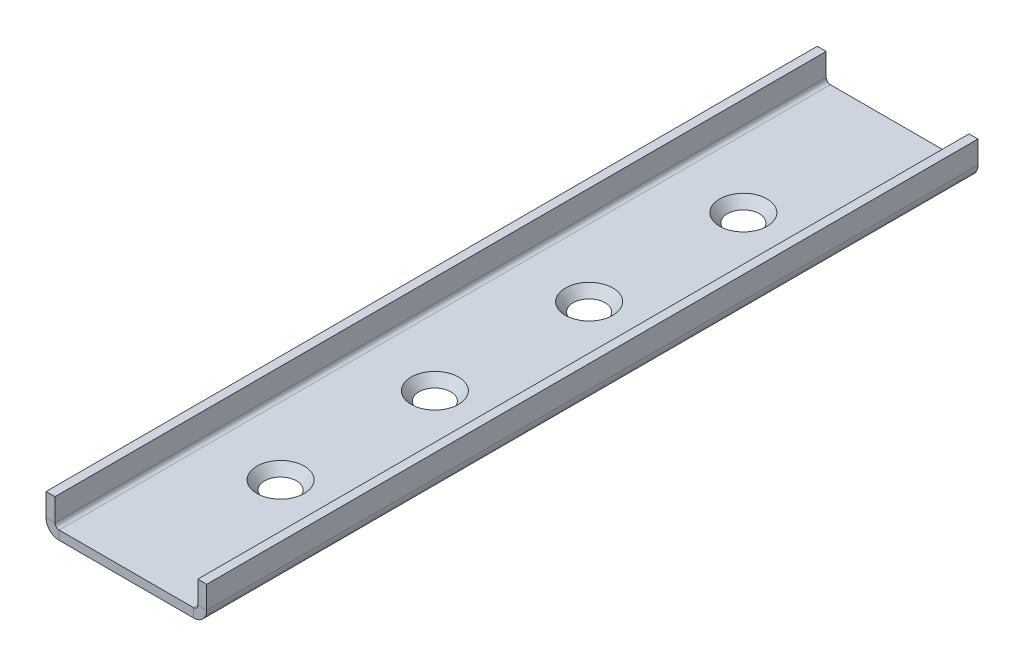
ISO-10303-21;
HEADER;
FILE_DESCRIPTION(('STEP AP214'),'2;1');
FILE_NAME('part.step','',(''),(''),'','','');
FILE_SCHEMA(('AUTOMOTIVE_DESIGN { 1 0 10303 214 1 1 1 1 }'));
ENDSEC;
DATA;
#1=APPLICATION_CONTEXT('core data for automotive mechanical design processes');
#2=APPLICATION_PROTOCOL_DEFINITION('international standard','automotive_design',2000,#1);
#3=PRODUCT_CONTEXT('',#1,'mechanical');
#4=PRODUCT('Part','Part','',(#3));
#5=PRODUCT_RELATED_PRODUCT_CATEGORY('part','',(#4));
#6=PRODUCT_DEFINITION_FORMATION('','',#4);
#7=PRODUCT_DEFINITION_CONTEXT('part definition',#1,'design');
#8=PRODUCT_DEFINITION('design','',#6,#7);
#9=PRODUCT_DEFINITION_SHAPE('','',#8);
#10=(LENGTH_UNIT() NAMED_UNIT(*) SI_UNIT(.MILLI.,.METRE.));
#11=(NAMED_UNIT(*) PLANE_ANGLE_UNIT() SI_UNIT($,.RADIAN.));
#12=(NAMED_UNIT(*) SI_UNIT($,.STERADIAN.) SOLID_ANGLE_UNIT());
#13=UNCERTAINTY_MEASURE_WITH_UNIT(LENGTH_MEASURE(1.E-05),#10,'distance_accuracy_value','');
#14=(GEOMETRIC_REPRESENTATION_CONTEXT(3) GLOBAL_UNCERTAINTY_ASSIGNED_CONTEXT((#13)) GLOBAL_UNIT_ASSIGNED_CONTEXT((#10,
#11,#12)) REPRESENTATION_CONTEXT('',''));
#15=CARTESIAN_POINT('',(0.,0.,0.));
#16=DIRECTION('',(0.,0.,1.));
#17=DIRECTION('',(1.,0.,0.));
#18=AXIS2_PLACEMENT_3D('',#15,#16,#17);
#19=CARTESIAN_POINT('',(0.,0.,0.));
#20=DIRECTION('',(0.,-1.,0.));
#21=DIRECTION('',(0.,0.,-1.));
#22=AXIS2_PLACEMENT_3D('',#19,#20,#21);
#23=PLANE('',#22);
#24=CARTESIAN_POINT('',(0.,0.,13.716));
#25=DIRECTION('',(0.,1.,0.));
#26=DIRECTION('',(0.,0.,1.));
#27=AXIS2_PLACEMENT_3D('',#24,#25,#26);
#28=CIRCLE('',#27,4.2164);
#29=CARTESIAN_POINT('',(0.,0.,17.9324));
#30=VERTEX_POINT('',#29);
#31=EDGE_CURVE('E230',#30,#30,#28,.T.);
#32=ORIENTED_EDGE('',*,*,#31,.F.);
#33=EDGE_LOOP('',(#32));
#34=FACE_BOUND('',#33,.T.);
#35=CARTESIAN_POINT('',(0.,0.,-41.148));
#36=DIRECTION('',(0.,1.,0.));
#37=DIRECTION('',(0.,0.,1.));
#38=AXIS2_PLACEMENT_3D('',#35,#36,#37);
#39=CIRCLE('',#38,4.2164);
#40=CARTESIAN_POINT('',(0.,0.,-36.9316));
#41=VERTEX_POINT('',#40);
#42=EDGE_CURVE('E225',#41,#41,#39,.T.);
#43=ORIENTED_EDGE('',*,*,#42,.F.);
#44=EDGE_LOOP('',(#43));
#45=FACE_BOUND('',#44,.T.);
#46=DIRECTION('',(0.,0.,-1.));
#47=VECTOR('',#46,1.);
#48=CARTESIAN_POINT('',(11.9634,0.,-68.58));
#49=LINE('',#48,#47);
#50=CARTESIAN_POINT('',(11.9634,0.,-68.58));
#51=VERTEX_POINT('',#50);
#52=CARTESIAN_POINT('',(11.9634,0.,68.58));
#53=VERTEX_POINT('',#52);
#54=EDGE_CURVE('E322',#51,#53,#49,.F.);
#55=ORIENTED_EDGE('',*,*,#54,.F.);
#56=DIRECTION('',(-1.,0.,0.));
#57=VECTOR('',#56,1.);
#58=CARTESIAN_POINT('',(-14.2875,0.,-68.58));
#59=LINE('',#58,#57);
#60=CARTESIAN_POINT('',(-11.9634,0.,-68.58));
#61=VERTEX_POINT('',#60);
#62=EDGE_CURVE('E210',#51,#61,#59,.T.);
#63=ORIENTED_EDGE('',*,*,#62,.T.);
#64=DIRECTION('',(0.,0.,1.));
#65=VECTOR('',#64,1.);
#66=CARTESIAN_POINT('',(-11.9634,0.,68.58));
#67=LINE('',#66,#65);
#68=CARTESIAN_POINT('',(-11.9634,0.,68.58));
#69=VERTEX_POINT('',#68);
#70=EDGE_CURVE('E158',#69,#61,#67,.F.);
#71=ORIENTED_EDGE('',*,*,#70,.F.);
#72=DIRECTION('',(1.,0.,0.));
#73=VECTOR('',#72,1.);
#74=CARTESIAN_POINT('',(-14.2875,0.,68.58));
#75=LINE('',#74,#73);
#76=EDGE_CURVE('E214',#69,#53,#75,.T.);
#77=ORIENTED_EDGE('',*,*,#76,.T.);
#78=EDGE_LOOP('',(#55,#63,#71,#77));
#79=FACE_BOUND('',#78,.T.);
#80=CARTESIAN_POINT('',(0.,0.,-13.716));
#81=DIRECTION('',(0.,1.,0.));
#82=DIRECTION('',(0.,0.,1.));
#83=AXIS2_PLACEMENT_3D('',#80,#81,#82);
#84=CIRCLE('',#83,4.2164);
#85=CARTESIAN_POINT('',(0.,0.,-9.4996));
#86=VERTEX_POINT('',#85);
#87=EDGE_CURVE('E229',#86,#86,#84,.T.);
#88=ORIENTED_EDGE('',*,*,#87,.F.);
#89=EDGE_LOOP('',(#88));
#90=FACE_BOUND('',#89,.T.);
#91=CARTESIAN_POINT('',(0.,0.,41.148));
#92=DIRECTION('',(0.,1.,0.));
#93=DIRECTION('',(0.,0.,1.));
#94=AXIS2_PLACEMENT_3D('',#91,#92,#93);
#95=CIRCLE('',#94,4.2164);
#96=CARTESIAN_POINT('',(0.,0.,45.3644));
#97=VERTEX_POINT('',#96);
#98=EDGE_CURVE('E248',#97,#97,#95,.T.);
#99=ORIENTED_EDGE('',*,*,#98,.F.);
#100=EDGE_LOOP('',(#99));
#101=FACE_BOUND('',#100,.T.);
#102=ADVANCED_FACE('F87',(#34,#45,#79,#90,#101),#23,.F.);
#103=CARTESIAN_POINT('',(0.,-1.5875,0.));
#104=DIRECTION('',(0.,-1.,0.));
#105=DIRECTION('',(0.,0.,-1.));
#106=AXIS2_PLACEMENT_3D('',#103,#104,#105);
#107=PLANE('',#106);
#108=CARTESIAN_POINT('',(0.,-1.5875,41.148));
#109=DIRECTION('',(0.,-1.,0.));
#110=DIRECTION('',(0.,0.,-1.));
#111=AXIS2_PLACEMENT_3D('',#108,#109,#110);
#112=CIRCLE('',#111,2.83640730371674);
#113=CARTESIAN_POINT('',(0.,-1.5875,38.3115926962833));
#114=VERTEX_POINT('',#113);
#115=EDGE_CURVE('E91',#114,#114,#112,.T.);
#116=ORIENTED_EDGE('',*,*,#115,.F.);
#117=EDGE_LOOP('',(#116));
#118=FACE_BOUND('',#117,.T.);
#119=CARTESIAN_POINT('',(0.,-1.5875,13.716));
#120=DIRECTION('',(0.,-1.,0.));
#121=DIRECTION('',(0.,0.,-1.));
#122=AXIS2_PLACEMENT_3D('',#119,#120,#121);
#123=CIRCLE('',#122,2.83640730371674);
#124=CARTESIAN_POINT('',(0.,-1.5875,10.8795926962833));
#125=VERTEX_POINT('',#124);
#126=EDGE_CURVE('E226',#125,#125,#123,.T.);
#127=ORIENTED_EDGE('',*,*,#126,.F.);
#128=EDGE_LOOP('',(#127));
#129=FACE_BOUND('',#128,.T.);
#130=DIRECTION('',(-1.,0.,0.));
#131=VECTOR('',#130,1.);
#132=CARTESIAN_POINT('',(-14.2875,-1.5875,-68.58));
#133=LINE('',#132,#131);
#134=CARTESIAN_POINT('',(11.9634,-1.5875,-68.58));
#135=VERTEX_POINT('',#134);
#136=CARTESIAN_POINT('',(-11.9634,-1.5875,-68.58));
#137=VERTEX_POINT('',#136);
#138=EDGE_CURVE('E97',#135,#137,#133,.T.);
#139=ORIENTED_EDGE('',*,*,#138,.F.);
#140=DIRECTION('',(0.,0.,-1.));
#141=VECTOR('',#140,1.);
#142=CARTESIAN_POINT('',(11.9634,-1.5875,-68.58));
#143=LINE('',#142,#141);
#144=CARTESIAN_POINT('',(11.9634,-1.5875,68.58));
#145=VERTEX_POINT('',#144);
#146=EDGE_CURVE('E305',#135,#145,#143,.F.);
#147=ORIENTED_EDGE('',*,*,#146,.T.);
#148=DIRECTION('',(1.,0.,0.));
#149=VECTOR('',#148,1.);
#150=CARTESIAN_POINT('',(-14.2875,-1.5875,68.58));
#151=LINE('',#150,#149);
#152=CARTESIAN_POINT('',(-11.9634,-1.5875,68.58));
#153=VERTEX_POINT('',#152);
#154=EDGE_CURVE('E13',#153,#145,#151,.T.);
#155=ORIENTED_EDGE('',*,*,#154,.F.);
#156=DIRECTION('',(0.,0.,1.));
#157=VECTOR('',#156,1.);
#158=CARTESIAN_POINT('',(-11.9634,-1.5875,68.58));
#159=LINE('',#158,#157);
#160=EDGE_CURVE('E112',#153,#137,#159,.F.);
#161=ORIENTED_EDGE('',*,*,#160,.T.);
#162=EDGE_LOOP('',(#139,#147,#155,#161));
#163=FACE_BOUND('',#162,.T.);
#164=CARTESIAN_POINT('',(0.,-1.5875,-41.148));
#165=DIRECTION('',(0.,-1.,0.));
#166=DIRECTION('',(0.,0.,-1.));
#167=AXIS2_PLACEMENT_3D('',#164,#165,#166);
#168=CIRCLE('',#167,2.83640730371674);
#169=CARTESIAN_POINT('',(0.,-1.5875,-43.9844073037167));
#170=VERTEX_POINT('',#169);
#171=EDGE_CURVE('E221',#170,#170,#168,.T.);
#172=ORIENTED_EDGE('',*,*,#171,.F.);
#173=EDGE_LOOP('',(#172));
#174=FACE_BOUND('',#173,.T.);
#175=CARTESIAN_POINT('',(0.,-1.5875,-13.716));
#176=DIRECTION('',(0.,-1.,0.));
#177=DIRECTION('',(0.,0.,-1.));
#178=AXIS2_PLACEMENT_3D('',#175,#176,#177);
#179=CIRCLE('',#178,2.83640730371674);
#180=CARTESIAN_POINT('',(0.,-1.5875,-16.5524073037167));
#181=VERTEX_POINT('',#180);
#182=EDGE_CURVE('E238',#181,#181,#179,.T.);
#183=ORIENTED_EDGE('',*,*,#182,.F.);
#184=EDGE_LOOP('',(#183));
#185=FACE_BOUND('',#184,.T.);
#186=ADVANCED_FACE('F393',(#118,#129,#163,#174,#185),#107,.T.);
#187=CARTESIAN_POINT('',(-14.2875,-1.5875,-68.58));
#188=DIRECTION('',(0.,0.,-1.));
#189=DIRECTION('',(-1.,0.,0.));
#190=AXIS2_PLACEMENT_3D('',#187,#188,#189);
#191=PLANE('',#190);
#192=ORIENTED_EDGE('',*,*,#62,.F.);
#193=DIRECTION('',(0.,-1.,0.));
#194=VECTOR('',#193,1.);
#195=CARTESIAN_POINT('',(11.9634,0.,-68.58));
#196=LINE('',#195,#194);
#197=EDGE_CURVE('E314',#51,#135,#196,.T.);
#198=ORIENTED_EDGE('',*,*,#197,.T.);
#199=ORIENTED_EDGE('',*,*,#138,.T.);
#200=DIRECTION('',(0.,-1.,0.));
#201=VECTOR('',#200,1.);
#202=CARTESIAN_POINT('',(-11.9634,0.,-68.58));
#203=LINE('',#202,#201);
#204=EDGE_CURVE('E206',#61,#137,#203,.T.);
#205=ORIENTED_EDGE('',*,*,#204,.F.);
#206=EDGE_LOOP('',(#192,#198,#199,#205));
#207=FACE_BOUND('',#206,.T.);
#208=ADVANCED_FACE('F89',(#207),#191,.T.);
#209=CARTESIAN_POINT('',(-14.2875,-1.5875,68.58));
#210=DIRECTION('',(0.,0.,1.));
#211=DIRECTION('',(1.,0.,0.));
#212=AXIS2_PLACEMENT_3D('',#209,#210,#211);
#213=PLANE('',#212);
#214=DIRECTION('',(0.,-1.,0.));
#215=VECTOR('',#214,1.);
#216=CARTESIAN_POINT('',(11.9634,0.,68.58));
#217=LINE('',#216,#215);
#218=EDGE_CURVE('E192',#53,#145,#217,.T.);
#219=ORIENTED_EDGE('',*,*,#218,.F.);
#220=ORIENTED_EDGE('',*,*,#76,.F.);
#221=DIRECTION('',(0.,-1.,0.));
#222=VECTOR('',#221,1.);
#223=CARTESIAN_POINT('',(-11.9634,0.,68.58));
#224=LINE('',#223,#222);
#225=EDGE_CURVE('E156',#69,#153,#224,.T.);
#226=ORIENTED_EDGE('',*,*,#225,.T.);
#227=ORIENTED_EDGE('',*,*,#154,.T.);
#228=EDGE_LOOP('',(#219,#220,#226,#227));
#229=FACE_BOUND('',#228,.T.);
#230=ADVANCED_FACE('F404',(#229),#213,.T.);
#231=CARTESIAN_POINT('',(-11.9634,0.736599999999999,-68.58));
#232=DIRECTION('',(0.,0.,-1.));
#233=DIRECTION('',(-1.,0.,0.));
#234=AXIS2_PLACEMENT_3D('',#231,#232,#233);
#235=PLANE('',#234);
#236=DIRECTION('',(1.,0.,0.));
#237=VECTOR('',#236,1.);
#238=CARTESIAN_POINT('',(-14.2875,0.736599999999991,-68.58));
#239=LINE('',#238,#237);
#240=CARTESIAN_POINT('',(-12.7,0.736599999999996,-68.58));
#241=VERTEX_POINT('',#240);
#242=CARTESIAN_POINT('',(-14.2875,0.73659999999999,-68.58));
#243=VERTEX_POINT('',#242);
#244=EDGE_CURVE('E147',#241,#243,#239,.F.);
#245=ORIENTED_EDGE('',*,*,#244,.F.);
#246=CARTESIAN_POINT('',(-11.9634,0.736599999999999,-68.58));
#247=DIRECTION('',(0.,0.,1.));
#248=DIRECTION('',(1.,0.,0.));
#249=AXIS2_PLACEMENT_3D('',#246,#247,#248);
#250=CIRCLE('',#249,0.7366);
#251=EDGE_CURVE('E140',#61,#241,#250,.F.);
#252=ORIENTED_EDGE('',*,*,#251,.F.);
#253=ORIENTED_EDGE('',*,*,#204,.T.);
#254=CARTESIAN_POINT('',(-11.9634,0.736599999999999,-68.58));
#255=DIRECTION('',(0.,0.,1.));
#256=DIRECTION('',(1.,0.,0.));
#257=AXIS2_PLACEMENT_3D('',#254,#255,#256);
#258=CIRCLE('',#257,2.3241);
#259=EDGE_CURVE('E195',#137,#243,#258,.F.);
#260=ORIENTED_EDGE('',*,*,#259,.T.);
#261=EDGE_LOOP('',(#245,#252,#253,#260));
#262=FACE_BOUND('',#261,.T.);
#263=ADVANCED_FACE('F406',(#262),#235,.T.);
#264=CARTESIAN_POINT('',(-11.9634,0.736599999999999,68.58));
#265=DIRECTION('',(0.,0.,-1.));
#266=DIRECTION('',(-1.,0.,0.));
#267=AXIS2_PLACEMENT_3D('',#264,#265,#266);
#268=PLANE('',#267);
#269=CARTESIAN_POINT('',(-11.9634,0.736599999999999,68.58));
#270=DIRECTION('',(0.,0.,1.));
#271=DIRECTION('',(1.,0.,0.));
#272=AXIS2_PLACEMENT_3D('',#269,#270,#271);
#273=CIRCLE('',#272,0.7366);
#274=CARTESIAN_POINT('',(-12.7,0.736599999999996,68.58));
#275=VERTEX_POINT('',#274);
#276=EDGE_CURVE('E137',#275,#69,#273,.T.);
#277=ORIENTED_EDGE('',*,*,#276,.F.);
#278=DIRECTION('',(1.,0.,0.));
#279=VECTOR('',#278,1.);
#280=CARTESIAN_POINT('',(-12.7,0.736599999999995,68.58));
#281=LINE('',#280,#279);
#282=CARTESIAN_POINT('',(-14.2875,0.736599999999989,68.58));
#283=VERTEX_POINT('',#282);
#284=EDGE_CURVE('E146',#275,#283,#281,.F.);
#285=ORIENTED_EDGE('',*,*,#284,.T.);
#286=CARTESIAN_POINT('',(-11.9634,0.736599999999999,68.58));
#287=DIRECTION('',(0.,0.,1.));
#288=DIRECTION('',(1.,0.,0.));
#289=AXIS2_PLACEMENT_3D('',#286,#287,#288);
#290=CIRCLE('',#289,2.3241);
#291=EDGE_CURVE('E196',#283,#153,#290,.T.);
#292=ORIENTED_EDGE('',*,*,#291,.T.);
#293=ORIENTED_EDGE('',*,*,#225,.F.);
#294=EDGE_LOOP('',(#277,#285,#292,#293));
#295=FACE_BOUND('',#294,.T.);
#296=ADVANCED_FACE('F152',(#295),#268,.F.);
#297=CARTESIAN_POINT('',(-11.9634,0.736599999999999,68.58));
#298=DIRECTION('',(0.,0.,1.));
#299=DIRECTION('',(-1.,0.,0.));
#300=AXIS2_PLACEMENT_3D('',#297,#298,#299);
#301=CYLINDRICAL_SURFACE('',#300,2.3241);
#302=ORIENTED_EDGE('',*,*,#160,.F.);
#303=ORIENTED_EDGE('',*,*,#291,.F.);
#304=DIRECTION('',(0.,0.,1.));
#305=VECTOR('',#304,1.);
#306=CARTESIAN_POINT('',(-14.2875,0.736599999999991,-68.58));
#307=LINE('',#306,#305);
#308=EDGE_CURVE('E172',#283,#243,#307,.F.);
#309=ORIENTED_EDGE('',*,*,#308,.T.);
#310=ORIENTED_EDGE('',*,*,#259,.F.);
#311=EDGE_LOOP('',(#302,#303,#309,#310));
#312=FACE_BOUND('',#311,.T.);
#313=ADVANCED_FACE('F488',(#312),#301,.T.);
#314=CARTESIAN_POINT('',(-11.9634,0.736599999999999,68.58));
#315=DIRECTION('',(0.,0.,1.));
#316=DIRECTION('',(-1.,0.,0.));
#317=AXIS2_PLACEMENT_3D('',#314,#315,#316);
#318=CYLINDRICAL_SURFACE('',#317,0.7366);
#319=ORIENTED_EDGE('',*,*,#70,.T.);
#320=ORIENTED_EDGE('',*,*,#251,.T.);
#321=DIRECTION('',(0.,0.,1.));
#322=VECTOR('',#321,1.);
#323=CARTESIAN_POINT('',(-12.7,0.736599999999997,-68.58));
#324=LINE('',#323,#322);
#325=EDGE_CURVE('E133',#241,#275,#324,.T.);
#326=ORIENTED_EDGE('',*,*,#325,.T.);
#327=ORIENTED_EDGE('',*,*,#276,.T.);
#328=EDGE_LOOP('',(#319,#320,#326,#327));
#329=FACE_BOUND('',#328,.T.);
#330=ADVANCED_FACE('F136',(#329),#318,.F.);
#331=CARTESIAN_POINT('',(-14.2875,4.7625,68.58));
#332=DIRECTION('',(0.,0.,-1.));
#333=DIRECTION('',(0.,1.,0.));
#334=AXIS2_PLACEMENT_3D('',#331,#332,#333);
#335=PLANE('',#334);
#336=ORIENTED_EDGE('',*,*,#284,.F.);
#337=DIRECTION('',(0.,-1.,0.));
#338=VECTOR('',#337,1.);
#339=CARTESIAN_POINT('',(-12.7,4.76250000000001,68.58));
#340=LINE('',#339,#338);
#341=CARTESIAN_POINT('',(-12.7,4.76250000000001,68.58));
#342=VERTEX_POINT('',#341);
#343=EDGE_CURVE('E167',#275,#342,#340,.F.);
#344=ORIENTED_EDGE('',*,*,#343,.T.);
#345=DIRECTION('',(1.,0.,0.));
#346=VECTOR('',#345,1.);
#347=CARTESIAN_POINT('',(-14.2875,4.7625,68.58));
#348=LINE('',#347,#346);
#349=CARTESIAN_POINT('',(-14.2875,4.7625,68.58));
#350=VERTEX_POINT('',#349);
#351=EDGE_CURVE('E159',#350,#342,#348,.T.);
#352=ORIENTED_EDGE('',*,*,#351,.F.);
#353=DIRECTION('',(0.,1.,0.));
#354=VECTOR('',#353,1.);
#355=CARTESIAN_POINT('',(-14.2875,1.4225571352781E-13,68.58));
#356=LINE('',#355,#354);
#357=EDGE_CURVE('E170',#283,#350,#356,.T.);
#358=ORIENTED_EDGE('',*,*,#357,.F.);
#359=EDGE_LOOP('',(#336,#344,#352,#358));
#360=FACE_BOUND('',#359,.T.);
#361=ADVANCED_FACE('F164',(#360),#335,.F.);
#362=CARTESIAN_POINT('',(-14.2875,0.,-68.58));
#363=DIRECTION('',(0.,0.,1.));
#364=DIRECTION('',(0.,-1.,0.));
#365=AXIS2_PLACEMENT_3D('',#362,#363,#364);
#366=PLANE('',#365);
#367=ORIENTED_EDGE('',*,*,#244,.T.);
#368=DIRECTION('',(0.,-1.,0.));
#369=VECTOR('',#368,1.);
#370=CARTESIAN_POINT('',(-14.2875,-2.57424575337246E-13,-68.58));
#371=LINE('',#370,#369);
#372=CARTESIAN_POINT('',(-14.2875,4.7625,-68.58));
#373=VERTEX_POINT('',#372);
#374=EDGE_CURVE('E340',#373,#243,#371,.T.);
#375=ORIENTED_EDGE('',*,*,#374,.F.);
#376=DIRECTION('',(1.,0.,0.));
#377=VECTOR('',#376,1.);
#378=CARTESIAN_POINT('',(-14.2875,4.7625,-68.58));
#379=LINE('',#378,#377);
#380=CARTESIAN_POINT('',(-12.7,4.76250000000001,-68.58));
#381=VERTEX_POINT('',#380);
#382=EDGE_CURVE('E336',#373,#381,#379,.T.);
#383=ORIENTED_EDGE('',*,*,#382,.T.);
#384=DIRECTION('',(0.,1.,0.));
#385=VECTOR('',#384,1.);
#386=CARTESIAN_POINT('',(-12.7,0.,-68.58));
#387=LINE('',#386,#385);
#388=EDGE_CURVE('E184',#381,#241,#387,.F.);
#389=ORIENTED_EDGE('',*,*,#388,.T.);
#390=EDGE_LOOP('',(#367,#375,#383,#389));
#391=FACE_BOUND('',#390,.T.);
#392=ADVANCED_FACE('F353',(#391),#366,.F.);
#393=CARTESIAN_POINT('',(-14.2875,0.,0.));
#394=DIRECTION('',(1.,0.,0.));
#395=DIRECTION('',(0.,1.,0.));
#396=AXIS2_PLACEMENT_3D('',#393,#394,#395);
#397=PLANE('',#396);
#398=ORIENTED_EDGE('',*,*,#308,.F.);
#399=ORIENTED_EDGE('',*,*,#357,.T.);
#400=DIRECTION('',(0.,0.,-1.));
#401=VECTOR('',#400,1.);
#402=CARTESIAN_POINT('',(-14.2875,4.7625,0.));
#403=LINE('',#402,#401);
#404=EDGE_CURVE('E344',#350,#373,#403,.T.);
#405=ORIENTED_EDGE('',*,*,#404,.T.);
#406=ORIENTED_EDGE('',*,*,#374,.T.);
#407=EDGE_LOOP('',(#398,#399,#405,#406));
#408=FACE_BOUND('',#407,.T.);
#409=ADVANCED_FACE('F376',(#408),#397,.F.);
#410=CARTESIAN_POINT('',(-12.7,0.,0.));
#411=DIRECTION('',(1.,0.,0.));
#412=DIRECTION('',(0.,1.,0.));
#413=AXIS2_PLACEMENT_3D('',#410,#411,#412);
#414=PLANE('',#413);
#415=ORIENTED_EDGE('',*,*,#343,.F.);
#416=ORIENTED_EDGE('',*,*,#325,.F.);
#417=ORIENTED_EDGE('',*,*,#388,.F.);
#418=DIRECTION('',(0.,0.,1.));
#419=VECTOR('',#418,1.);
#420=CARTESIAN_POINT('',(-12.7,4.76250000000001,-68.58));
#421=LINE('',#420,#419);
#422=EDGE_CURVE('E177',#342,#381,#421,.F.);
#423=ORIENTED_EDGE('',*,*,#422,.F.);
#424=EDGE_LOOP('',(#415,#416,#417,#423));
#425=FACE_BOUND('',#424,.T.);
#426=ADVANCED_FACE('F175',(#425),#414,.T.);
#427=CARTESIAN_POINT('',(-14.2875,4.7625,-68.58));
#428=DIRECTION('',(0.,-1.,0.));
#429=DIRECTION('',(1.,0.,0.));
#430=AXIS2_PLACEMENT_3D('',#427,#428,#429);
#431=PLANE('',#430);
#432=ORIENTED_EDGE('',*,*,#422,.T.);
#433=ORIENTED_EDGE('',*,*,#382,.F.);
#434=ORIENTED_EDGE('',*,*,#404,.F.);
#435=ORIENTED_EDGE('',*,*,#351,.T.);
#436=EDGE_LOOP('',(#432,#433,#434,#435));
#437=FACE_BOUND('',#436,.T.);
#438=ADVANCED_FACE('F377',(#437),#431,.F.);
#439=CARTESIAN_POINT('',(11.9634,0.736600000000001,68.58));
#440=DIRECTION('',(0.,0.,1.));
#441=DIRECTION('',(1.,0.,0.));
#442=AXIS2_PLACEMENT_3D('',#439,#440,#441);
#443=PLANE('',#442);
#444=DIRECTION('',(1.,0.,0.));
#445=VECTOR('',#444,1.);
#446=CARTESIAN_POINT('',(14.2875,0.736599999999991,68.58));
#447=LINE('',#446,#445);
#448=CARTESIAN_POINT('',(12.7,0.736599999999998,68.58));
#449=VERTEX_POINT('',#448);
#450=CARTESIAN_POINT('',(14.2875,0.736599999999992,68.58));
#451=VERTEX_POINT('',#450);
#452=EDGE_CURVE('E224',#449,#451,#447,.T.);
#453=ORIENTED_EDGE('',*,*,#452,.F.);
#454=CARTESIAN_POINT('',(11.9634,0.736600000000001,68.58));
#455=DIRECTION('',(0.,0.,-1.));
#456=DIRECTION('',(-1.,0.,0.));
#457=AXIS2_PLACEMENT_3D('',#454,#455,#456);
#458=CIRCLE('',#457,0.7366);
#459=EDGE_CURVE('E318',#53,#449,#458,.F.);
#460=ORIENTED_EDGE('',*,*,#459,.F.);
#461=ORIENTED_EDGE('',*,*,#218,.T.);
#462=CARTESIAN_POINT('',(11.9634,0.736600000000001,68.58));
#463=DIRECTION('',(0.,0.,-1.));
#464=DIRECTION('',(-1.,0.,0.));
#465=AXIS2_PLACEMENT_3D('',#462,#463,#464);
#466=CIRCLE('',#465,2.3241);
#467=EDGE_CURVE('E309',#145,#451,#466,.F.);
#468=ORIENTED_EDGE('',*,*,#467,.T.);
#469=EDGE_LOOP('',(#453,#460,#461,#468));
#470=FACE_BOUND('',#469,.T.);
#471=ADVANCED_FACE('F379',(#470),#443,.T.);
#472=CARTESIAN_POINT('',(11.9634,0.736600000000001,-68.58));
#473=DIRECTION('',(0.,0.,1.));
#474=DIRECTION('',(1.,0.,0.));
#475=AXIS2_PLACEMENT_3D('',#472,#473,#474);
#476=PLANE('',#475);
#477=CARTESIAN_POINT('',(11.9634,0.736600000000001,-68.58));
#478=DIRECTION('',(0.,0.,-1.));
#479=DIRECTION('',(-1.,0.,0.));
#480=AXIS2_PLACEMENT_3D('',#477,#478,#479);
#481=CIRCLE('',#480,0.7366);
#482=CARTESIAN_POINT('',(12.7,0.736599999999998,-68.58));
#483=VERTEX_POINT('',#482);
#484=EDGE_CURVE('E261',#483,#51,#481,.T.);
#485=ORIENTED_EDGE('',*,*,#484,.F.);
#486=DIRECTION('',(1.,0.,0.));
#487=VECTOR('',#486,1.);
#488=CARTESIAN_POINT('',(12.7,0.736599999999999,-68.58));
#489=LINE('',#488,#487);
#490=CARTESIAN_POINT('',(14.2875,0.736599999999993,-68.58));
#491=VERTEX_POINT('',#490);
#492=EDGE_CURVE('E294',#483,#491,#489,.T.);
#493=ORIENTED_EDGE('',*,*,#492,.T.);
#494=CARTESIAN_POINT('',(11.9634,0.736600000000001,-68.58));
#495=DIRECTION('',(0.,0.,-1.));
#496=DIRECTION('',(-1.,0.,0.));
#497=AXIS2_PLACEMENT_3D('',#494,#495,#496);
#498=CIRCLE('',#497,2.3241);
#499=EDGE_CURVE('E310',#491,#135,#498,.T.);
#500=ORIENTED_EDGE('',*,*,#499,.T.);
#501=ORIENTED_EDGE('',*,*,#197,.F.);
#502=EDGE_LOOP('',(#485,#493,#500,#501));
#503=FACE_BOUND('',#502,.T.);
#504=ADVANCED_FACE('F386',(#503),#476,.F.);
#505=CARTESIAN_POINT('',(11.9634,0.736600000000001,-68.58));
#506=DIRECTION('',(0.,0.,-1.));
#507=DIRECTION('',(1.,0.,0.));
#508=AXIS2_PLACEMENT_3D('',#505,#506,#507);
#509=CYLINDRICAL_SURFACE('',#508,2.3241);
#510=ORIENTED_EDGE('',*,*,#146,.F.);
#511=ORIENTED_EDGE('',*,*,#499,.F.);
#512=DIRECTION('',(0.,0.,-1.));
#513=VECTOR('',#512,1.);
#514=CARTESIAN_POINT('',(14.2875,0.736599999999991,68.58));
#515=LINE('',#514,#513);
#516=EDGE_CURVE('E290',#491,#451,#515,.F.);
#517=ORIENTED_EDGE('',*,*,#516,.T.);
#518=ORIENTED_EDGE('',*,*,#467,.F.);
#519=EDGE_LOOP('',(#510,#511,#517,#518));
#520=FACE_BOUND('',#519,.T.);
#521=ADVANCED_FACE('F447',(#520),#509,.T.);
#522=CARTESIAN_POINT('',(11.9634,0.736600000000001,-68.58));
#523=DIRECTION('',(0.,0.,-1.));
#524=DIRECTION('',(1.,0.,0.));
#525=AXIS2_PLACEMENT_3D('',#522,#523,#524);
#526=CYLINDRICAL_SURFACE('',#525,0.7366);
#527=ORIENTED_EDGE('',*,*,#54,.T.);
#528=ORIENTED_EDGE('',*,*,#459,.T.);
#529=DIRECTION('',(0.,0.,-1.));
#530=VECTOR('',#529,1.);
#531=CARTESIAN_POINT('',(12.7,0.736599999999997,68.58));
#532=LINE('',#531,#530);
#533=EDGE_CURVE('E298',#449,#483,#532,.T.);
#534=ORIENTED_EDGE('',*,*,#533,.T.);
#535=ORIENTED_EDGE('',*,*,#484,.T.);
#536=EDGE_LOOP('',(#527,#528,#534,#535));
#537=FACE_BOUND('',#536,.T.);
#538=ADVANCED_FACE('F462',(#537),#526,.F.);
#539=CARTESIAN_POINT('',(14.2875,0.,-68.58));
#540=DIRECTION('',(0.,0.,-1.));
#541=DIRECTION('',(0.,1.,0.));
#542=AXIS2_PLACEMENT_3D('',#539,#540,#541);
#543=PLANE('',#542);
#544=DIRECTION('',(0.,1.,0.));
#545=VECTOR('',#544,1.);
#546=CARTESIAN_POINT('',(14.2875,0.,-68.58));
#547=LINE('',#546,#545);
#548=CARTESIAN_POINT('',(14.2875,4.7625,-68.58));
#549=VERTEX_POINT('',#548);
#550=EDGE_CURVE('E274',#549,#491,#547,.F.);
#551=ORIENTED_EDGE('',*,*,#550,.T.);
#552=ORIENTED_EDGE('',*,*,#492,.F.);
#553=DIRECTION('',(0.,-1.,0.));
#554=VECTOR('',#553,1.);
#555=CARTESIAN_POINT('',(12.7,-2.51881848711832E-13,-68.58));
#556=LINE('',#555,#554);
#557=CARTESIAN_POINT('',(12.7,4.76250000000001,-68.58));
#558=VERTEX_POINT('',#557);
#559=EDGE_CURVE('E286',#558,#483,#556,.T.);
#560=ORIENTED_EDGE('',*,*,#559,.F.);
#561=DIRECTION('',(-1.,0.,0.));
#562=VECTOR('',#561,1.);
#563=CARTESIAN_POINT('',(14.2875,4.7625,-68.58));
#564=LINE('',#563,#562);
#565=EDGE_CURVE('E257',#549,#558,#564,.T.);
#566=ORIENTED_EDGE('',*,*,#565,.F.);
#567=EDGE_LOOP('',(#551,#552,#560,#566));
#568=FACE_BOUND('',#567,.T.);
#569=ADVANCED_FACE('F465',(#568),#543,.T.);
#570=CARTESIAN_POINT('',(14.2875,4.7625,68.58));
#571=DIRECTION('',(0.,0.,1.));
#572=DIRECTION('',(0.,-1.,0.));
#573=AXIS2_PLACEMENT_3D('',#570,#571,#572);
#574=PLANE('',#573);
#575=DIRECTION('',(0.,1.,0.));
#576=VECTOR('',#575,1.);
#577=CARTESIAN_POINT('',(12.7,1.47798440153224E-13,68.58));
#578=LINE('',#577,#576);
#579=CARTESIAN_POINT('',(12.7,4.76250000000001,68.58));
#580=VERTEX_POINT('',#579);
#581=EDGE_CURVE('E278',#449,#580,#578,.T.);
#582=ORIENTED_EDGE('',*,*,#581,.F.);
#583=ORIENTED_EDGE('',*,*,#452,.T.);
#584=DIRECTION('',(0.,-1.,0.));
#585=VECTOR('',#584,1.);
#586=CARTESIAN_POINT('',(14.2875,4.7625,68.58));
#587=LINE('',#586,#585);
#588=CARTESIAN_POINT('',(14.2875,4.7625,68.58));
#589=VERTEX_POINT('',#588);
#590=EDGE_CURVE('E266',#451,#589,#587,.F.);
#591=ORIENTED_EDGE('',*,*,#590,.T.);
#592=DIRECTION('',(-1.,0.,0.));
#593=VECTOR('',#592,1.);
#594=CARTESIAN_POINT('',(14.2875,4.7625,68.58));
#595=LINE('',#594,#593);
#596=EDGE_CURVE('E262',#589,#580,#595,.T.);
#597=ORIENTED_EDGE('',*,*,#596,.T.);
#598=EDGE_LOOP('',(#582,#583,#591,#597));
#599=FACE_BOUND('',#598,.T.);
#600=ADVANCED_FACE('F451',(#599),#574,.T.);
#601=CARTESIAN_POINT('',(14.2875,0.,0.));
#602=DIRECTION('',(-1.,0.,0.));
#603=DIRECTION('',(0.,1.,0.));
#604=AXIS2_PLACEMENT_3D('',#601,#602,#603);
#605=PLANE('',#604);
#606=ORIENTED_EDGE('',*,*,#516,.F.);
#607=ORIENTED_EDGE('',*,*,#550,.F.);
#608=DIRECTION('',(0.,0.,1.));
#609=VECTOR('',#608,1.);
#610=CARTESIAN_POINT('',(14.2875,4.7625,-68.58));
#611=LINE('',#610,#609);
#612=EDGE_CURVE('E270',#589,#549,#611,.F.);
#613=ORIENTED_EDGE('',*,*,#612,.F.);
#614=ORIENTED_EDGE('',*,*,#590,.F.);
#615=EDGE_LOOP('',(#606,#607,#613,#614));
#616=FACE_BOUND('',#615,.T.);
#617=ADVANCED_FACE('F453',(#616),#605,.F.);
#618=CARTESIAN_POINT('',(12.7,0.,0.));
#619=DIRECTION('',(-1.,0.,0.));
#620=DIRECTION('',(0.,1.,0.));
#621=AXIS2_PLACEMENT_3D('',#618,#619,#620);
#622=PLANE('',#621);
#623=ORIENTED_EDGE('',*,*,#559,.T.);
#624=ORIENTED_EDGE('',*,*,#533,.F.);
#625=ORIENTED_EDGE('',*,*,#581,.T.);
#626=DIRECTION('',(0.,0.,-1.));
#627=VECTOR('',#626,1.);
#628=CARTESIAN_POINT('',(12.7,4.76250000000001,0.));
#629=LINE('',#628,#627);
#630=EDGE_CURVE('E282',#580,#558,#629,.T.);
#631=ORIENTED_EDGE('',*,*,#630,.T.);
#632=EDGE_LOOP('',(#623,#624,#625,#631));
#633=FACE_BOUND('',#632,.T.);
#634=ADVANCED_FACE('F459',(#633),#622,.T.);
#635=CARTESIAN_POINT('',(14.2875,4.7625,-68.58));
#636=DIRECTION('',(0.,1.,0.));
#637=DIRECTION('',(-1.,0.,0.));
#638=AXIS2_PLACEMENT_3D('',#635,#636,#637);
#639=PLANE('',#638);
#640=ORIENTED_EDGE('',*,*,#630,.F.);
#641=ORIENTED_EDGE('',*,*,#596,.F.);
#642=ORIENTED_EDGE('',*,*,#612,.T.);
#643=ORIENTED_EDGE('',*,*,#565,.T.);
#644=EDGE_LOOP('',(#640,#641,#642,#643));
#645=FACE_BOUND('',#644,.T.);
#646=ADVANCED_FACE('F456',(#645),#639,.T.);
#647=CARTESIAN_POINT('',(0.,0.,-41.148));
#648=DIRECTION('',(0.,1.,0.));
#649=DIRECTION('',(0.,0.,1.));
#650=AXIS2_PLACEMENT_3D('',#647,#648,#649);
#651=CONICAL_SURFACE('',#650,4.2164,0.715584993317675);
#652=ORIENTED_EDGE('',*,*,#171,.T.);
#653=EDGE_LOOP('',(#652));
#654=FACE_BOUND('',#653,.T.);
#655=ORIENTED_EDGE('',*,*,#42,.T.);
#656=EDGE_LOOP('',(#655));
#657=FACE_BOUND('',#656,.T.);
#658=ADVANCED_FACE('F610',(#654,#657),#651,.F.);
#659=CARTESIAN_POINT('',(0.,0.,-13.716));
#660=DIRECTION('',(0.,1.,0.));
#661=DIRECTION('',(0.,0.,1.));
#662=AXIS2_PLACEMENT_3D('',#659,#660,#661);
#663=CONICAL_SURFACE('',#662,4.2164,0.715584993317675);
#664=ORIENTED_EDGE('',*,*,#182,.T.);
#665=EDGE_LOOP('',(#664));
#666=FACE_BOUND('',#665,.T.);
#667=ORIENTED_EDGE('',*,*,#87,.T.);
#668=EDGE_LOOP('',(#667));
#669=FACE_BOUND('',#668,.T.);
#670=ADVANCED_FACE('F631',(#666,#669),#663,.F.);
#671=CARTESIAN_POINT('',(0.,0.,13.716));
#672=DIRECTION('',(0.,1.,0.));
#673=DIRECTION('',(0.,0.,1.));
#674=AXIS2_PLACEMENT_3D('',#671,#672,#673);
#675=CONICAL_SURFACE('',#674,4.2164,0.715584993317675);
#676=ORIENTED_EDGE('',*,*,#126,.T.);
#677=EDGE_LOOP('',(#676));
#678=FACE_BOUND('',#677,.T.);
#679=ORIENTED_EDGE('',*,*,#31,.T.);
#680=EDGE_LOOP('',(#679));
#681=FACE_BOUND('',#680,.T.);
#682=ADVANCED_FACE('F641',(#678,#681),#675,.F.);
#683=CARTESIAN_POINT('',(0.,0.,41.148));
#684=DIRECTION('',(0.,1.,0.));
#685=DIRECTION('',(0.,0.,1.));
#686=AXIS2_PLACEMENT_3D('',#683,#684,#685);
#687=CONICAL_SURFACE('',#686,4.2164,0.715584993317675);
#688=ORIENTED_EDGE('',*,*,#115,.T.);
#689=EDGE_LOOP('',(#688));
#690=FACE_BOUND('',#689,.T.);
#691=ORIENTED_EDGE('',*,*,#98,.T.);
#692=EDGE_LOOP('',(#691));
#693=FACE_BOUND('',#692,.T.);
#694=ADVANCED_FACE('F651',(#690,#693),#687,.F.);
#695=CLOSED_SHELL('',(#102,#186,#208,#230,#263,#296,#313,#330,#361,#392,#409,#426,#438,#471,
#504,#521,#538,#569,#600,#617,#634,#646,#658,#670,#682,#694));
#696=MANIFOLD_SOLID_BREP('B2',#695);
#697=ADVANCED_BREP_SHAPE_REPRESENTATION('',(#18,#696),#14);
#698=SHAPE_DEFINITION_REPRESENTATION(#9,#697);
ENDSEC;
END-ISO-10303-21;
